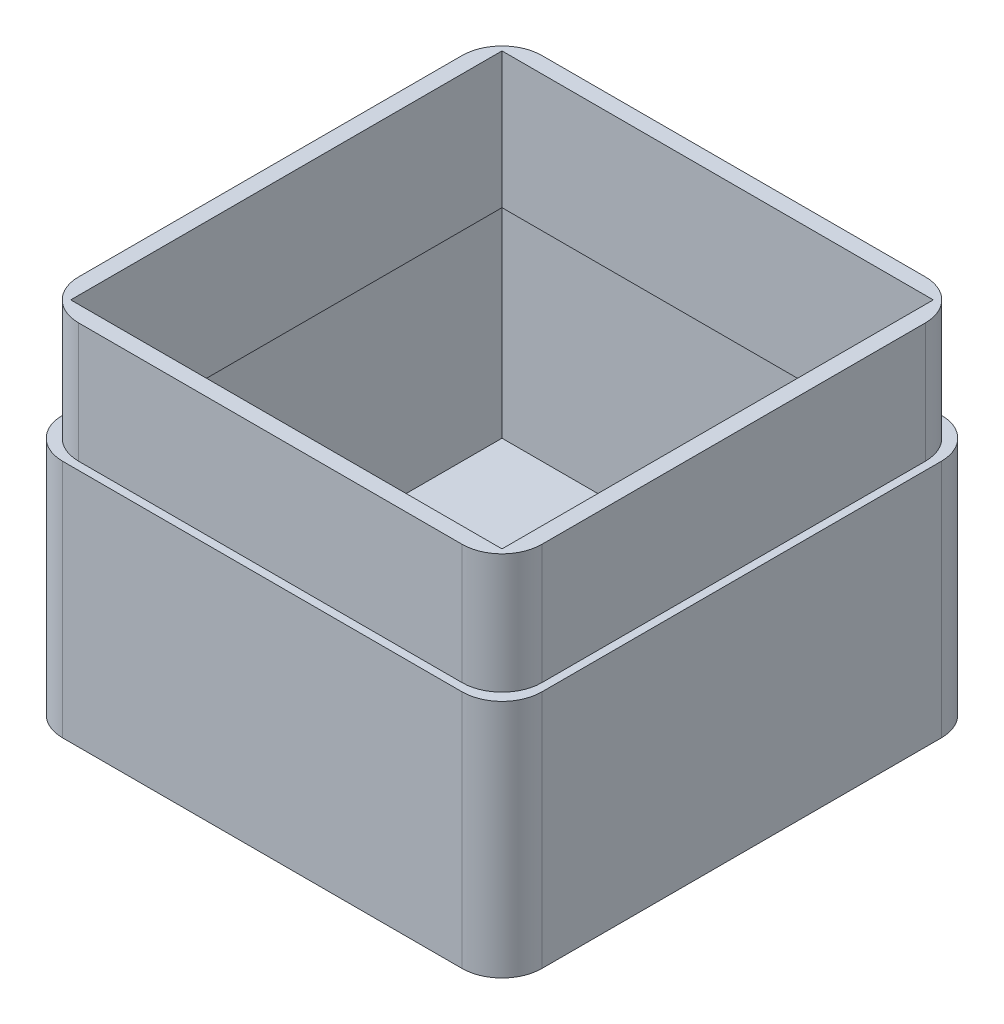
ISO-10303-21;
HEADER;
FILE_DESCRIPTION(('STEP AP214'),'2;1');
FILE_NAME('part.step','',(''),(''),'','','');
FILE_SCHEMA(('AUTOMOTIVE_DESIGN { 1 0 10303 214 1 1 1 1 }'));
ENDSEC;
DATA;
#1=APPLICATION_CONTEXT('core data for automotive mechanical design processes');
#2=APPLICATION_PROTOCOL_DEFINITION('international standard','automotive_design',2000,#1);
#3=PRODUCT_CONTEXT('',#1,'mechanical');
#4=PRODUCT('Part','Part','',(#3));
#5=PRODUCT_RELATED_PRODUCT_CATEGORY('part','',(#4));
#6=PRODUCT_DEFINITION_FORMATION('','',#4);
#7=PRODUCT_DEFINITION_CONTEXT('part definition',#1,'design');
#8=PRODUCT_DEFINITION('design','',#6,#7);
#9=PRODUCT_DEFINITION_SHAPE('','',#8);
#10=(LENGTH_UNIT() NAMED_UNIT(*) SI_UNIT(.MILLI.,.METRE.));
#11=(NAMED_UNIT(*) PLANE_ANGLE_UNIT() SI_UNIT($,.RADIAN.));
#12=(NAMED_UNIT(*) SI_UNIT($,.STERADIAN.) SOLID_ANGLE_UNIT());
#13=UNCERTAINTY_MEASURE_WITH_UNIT(LENGTH_MEASURE(1.E-05),#10,'distance_accuracy_value','');
#14=(GEOMETRIC_REPRESENTATION_CONTEXT(3) GLOBAL_UNCERTAINTY_ASSIGNED_CONTEXT((#13)) GLOBAL_UNIT_ASSIGNED_CONTEXT((#10,
#11,#12)) REPRESENTATION_CONTEXT('',''));
#15=CARTESIAN_POINT('',(0.,0.,0.));
#16=DIRECTION('',(0.,0.,1.));
#17=DIRECTION('',(1.,0.,0.));
#18=AXIS2_PLACEMENT_3D('',#15,#16,#17);
#19=CARTESIAN_POINT('',(-56.9459553231326,90.,-24.7862878858191));
#20=DIRECTION('',(1.,0.,0.));
#21=DIRECTION('',(0.,0.,-1.));
#22=AXIS2_PLACEMENT_3D('',#19,#20,#21);
#23=PLANE('',#22);
#24=DIRECTION('',(0.,0.,1.));
#25=VECTOR('',#24,1.);
#26=CARTESIAN_POINT('',(-56.9459553231326,0.,-24.7862878858191));
#27=LINE('',#26,#25);
#28=CARTESIAN_POINT('',(-56.9459553231326,0.,-14.7862878858191));
#29=VERTEX_POINT('',#28);
#30=CARTESIAN_POINT('',(-56.9459553231326,0.,85.2137121141809));
#31=VERTEX_POINT('',#30);
#32=EDGE_CURVE('E302',#29,#31,#27,.T.);
#33=ORIENTED_EDGE('',*,*,#32,.T.);
#34=DIRECTION('',(0.,-1.,0.));
#35=VECTOR('',#34,1.);
#36=CARTESIAN_POINT('',(-56.9459553231326,90.,85.2137121141809));
#37=LINE('',#36,#35);
#38=CARTESIAN_POINT('',(-56.9459553231326,60.0000000000002,85.2137121141809));
#39=VERTEX_POINT('',#38);
#40=EDGE_CURVE('E352',#31,#39,#37,.F.);
#41=ORIENTED_EDGE('',*,*,#40,.T.);
#42=DIRECTION('',(0.,0.,1.));
#43=VECTOR('',#42,1.);
#44=CARTESIAN_POINT('',(-56.9459553231326,60.0000000000002,-24.7862878858191));
#45=LINE('',#44,#43);
#46=CARTESIAN_POINT('',(-56.9459553231326,60.0000000000002,-14.7862878858191));
#47=VERTEX_POINT('',#46);
#48=EDGE_CURVE('E294',#47,#39,#45,.T.);
#49=ORIENTED_EDGE('',*,*,#48,.F.);
#50=DIRECTION('',(0.,-1.,0.));
#51=VECTOR('',#50,1.);
#52=CARTESIAN_POINT('',(-56.9459553231326,90.,-14.7862878858191));
#53=LINE('',#52,#51);
#54=EDGE_CURVE('E349',#47,#29,#53,.T.);
#55=ORIENTED_EDGE('',*,*,#54,.T.);
#56=EDGE_LOOP('',(#33,#41,#49,#55));
#57=FACE_BOUND('',#56,.T.);
#58=ADVANCED_FACE('F33',(#57),#23,.F.);
#59=CARTESIAN_POINT('',(-56.9459553231326,90.,95.2137121141809));
#60=DIRECTION('',(0.,0.,-1.));
#61=DIRECTION('',(-1.,0.,0.));
#62=AXIS2_PLACEMENT_3D('',#59,#60,#61);
#63=PLANE('',#62);
#64=DIRECTION('',(1.,0.,0.));
#65=VECTOR('',#64,1.);
#66=CARTESIAN_POINT('',(-56.9459553231326,0.,95.2137121141809));
#67=LINE('',#66,#65);
#68=CARTESIAN_POINT('',(-46.9459553231326,0.,95.2137121141809));
#69=VERTEX_POINT('',#68);
#70=CARTESIAN_POINT('',(53.0540446768674,0.,95.2137121141809));
#71=VERTEX_POINT('',#70);
#72=EDGE_CURVE('E305',#69,#71,#67,.T.);
#73=ORIENTED_EDGE('',*,*,#72,.T.);
#74=DIRECTION('',(0.,-1.,0.));
#75=VECTOR('',#74,1.);
#76=CARTESIAN_POINT('',(53.0540446768674,90.,95.2137121141809));
#77=LINE('',#76,#75);
#78=CARTESIAN_POINT('',(53.0540446768674,60.0000000000002,95.2137121141809));
#79=VERTEX_POINT('',#78);
#80=EDGE_CURVE('E347',#71,#79,#77,.F.);
#81=ORIENTED_EDGE('',*,*,#80,.T.);
#82=DIRECTION('',(1.,0.,0.));
#83=VECTOR('',#82,1.);
#84=CARTESIAN_POINT('',(-56.9459553231326,60.0000000000002,95.2137121141809));
#85=LINE('',#84,#83);
#86=CARTESIAN_POINT('',(-46.9459553231326,60.0000000000002,95.2137121141809));
#87=VERTEX_POINT('',#86);
#88=EDGE_CURVE('E297',#87,#79,#85,.T.);
#89=ORIENTED_EDGE('',*,*,#88,.F.);
#90=DIRECTION('',(0.,-1.,0.));
#91=VECTOR('',#90,1.);
#92=CARTESIAN_POINT('',(-46.9459553231326,90.,95.2137121141809));
#93=LINE('',#92,#91);
#94=EDGE_CURVE('E344',#87,#69,#93,.T.);
#95=ORIENTED_EDGE('',*,*,#94,.T.);
#96=EDGE_LOOP('',(#73,#81,#89,#95));
#97=FACE_BOUND('',#96,.T.);
#98=ADVANCED_FACE('F387',(#97),#63,.F.);
#99=CARTESIAN_POINT('',(63.0540446768674,90.,-24.7862878858191));
#100=DIRECTION('',(-1.,0.,0.));
#101=DIRECTION('',(0.,0.,1.));
#102=AXIS2_PLACEMENT_3D('',#99,#100,#101);
#103=PLANE('',#102);
#104=DIRECTION('',(0.,0.,-1.));
#105=VECTOR('',#104,1.);
#106=CARTESIAN_POINT('',(63.0540446768674,60.0000000000002,95.2137121141809));
#107=LINE('',#106,#105);
#108=CARTESIAN_POINT('',(63.0540446768674,60.0000000000002,85.2137121141809));
#109=VERTEX_POINT('',#108);
#110=CARTESIAN_POINT('',(63.0540446768674,60.0000000000002,-14.7862878858191));
#111=VERTEX_POINT('',#110);
#112=EDGE_CURVE('E300',#109,#111,#107,.T.);
#113=ORIENTED_EDGE('',*,*,#112,.F.);
#114=DIRECTION('',(0.,-1.,0.));
#115=VECTOR('',#114,1.);
#116=CARTESIAN_POINT('',(63.0540446768674,90.,85.2137121141809));
#117=LINE('',#116,#115);
#118=CARTESIAN_POINT('',(63.0540446768674,0.,85.2137121141809));
#119=VERTEX_POINT('',#118);
#120=EDGE_CURVE('E333',#109,#119,#117,.T.);
#121=ORIENTED_EDGE('',*,*,#120,.T.);
#122=DIRECTION('',(0.,0.,-1.));
#123=VECTOR('',#122,1.);
#124=CARTESIAN_POINT('',(63.0540446768674,0.,-24.7862878858191));
#125=LINE('',#124,#123);
#126=CARTESIAN_POINT('',(63.0540446768674,0.,-14.7862878858191));
#127=VERTEX_POINT('',#126);
#128=EDGE_CURVE('E308',#119,#127,#125,.T.);
#129=ORIENTED_EDGE('',*,*,#128,.T.);
#130=DIRECTION('',(0.,-1.,0.));
#131=VECTOR('',#130,1.);
#132=CARTESIAN_POINT('',(63.0540446768674,90.,-14.7862878858191));
#133=LINE('',#132,#131);
#134=EDGE_CURVE('E331',#127,#111,#133,.F.);
#135=ORIENTED_EDGE('',*,*,#134,.T.);
#136=EDGE_LOOP('',(#113,#121,#129,#135));
#137=FACE_BOUND('',#136,.T.);
#138=ADVANCED_FACE('F407',(#137),#103,.F.);
#139=CARTESIAN_POINT('',(-56.9459553231326,90.,-24.7862878858191));
#140=DIRECTION('',(0.,0.,1.));
#141=DIRECTION('',(1.,0.,0.));
#142=AXIS2_PLACEMENT_3D('',#139,#140,#141);
#143=PLANE('',#142);
#144=DIRECTION('',(-1.,0.,0.));
#145=VECTOR('',#144,1.);
#146=CARTESIAN_POINT('',(-56.9459553231326,0.,-24.7862878858191));
#147=LINE('',#146,#145);
#148=CARTESIAN_POINT('',(53.0540446768674,0.,-24.7862878858191));
#149=VERTEX_POINT('',#148);
#150=CARTESIAN_POINT('',(-46.9459553231326,0.,-24.7862878858191));
#151=VERTEX_POINT('',#150);
#152=EDGE_CURVE('E311',#149,#151,#147,.T.);
#153=ORIENTED_EDGE('',*,*,#152,.T.);
#154=DIRECTION('',(0.,-1.,0.));
#155=VECTOR('',#154,1.);
#156=CARTESIAN_POINT('',(-46.9459553231326,90.,-24.7862878858191));
#157=LINE('',#156,#155);
#158=CARTESIAN_POINT('',(-46.9459553231326,60.0000000000002,-24.7862878858191));
#159=VERTEX_POINT('',#158);
#160=EDGE_CURVE('E48',#151,#159,#157,.F.);
#161=ORIENTED_EDGE('',*,*,#160,.T.);
#162=DIRECTION('',(-1.,0.,0.));
#163=VECTOR('',#162,1.);
#164=CARTESIAN_POINT('',(63.0540446768674,60.0000000000002,-24.7862878858191));
#165=LINE('',#164,#163);
#166=CARTESIAN_POINT('',(53.0540446768674,60.0000000000002,-24.7862878858191));
#167=VERTEX_POINT('',#166);
#168=EDGE_CURVE('E284',#167,#159,#165,.T.);
#169=ORIENTED_EDGE('',*,*,#168,.F.);
#170=DIRECTION('',(0.,-1.,0.));
#171=VECTOR('',#170,1.);
#172=CARTESIAN_POINT('',(53.0540446768674,90.,-24.7862878858191));
#173=LINE('',#172,#171);
#174=EDGE_CURVE('E364',#167,#149,#173,.T.);
#175=ORIENTED_EDGE('',*,*,#174,.T.);
#176=EDGE_LOOP('',(#153,#161,#169,#175));
#177=FACE_BOUND('',#176,.T.);
#178=ADVANCED_FACE('F401',(#177),#143,.F.);
#179=CARTESIAN_POINT('',(0.,0.,0.));
#180=DIRECTION('',(0.,1.,0.));
#181=DIRECTION('',(0.,0.,1.));
#182=AXIS2_PLACEMENT_3D('',#179,#180,#181);
#183=PLANE('',#182);
#184=ORIENTED_EDGE('',*,*,#128,.F.);
#185=CARTESIAN_POINT('',(53.0540446768674,0.,85.2137121141809));
#186=DIRECTION('',(0.,1.,0.));
#187=DIRECTION('',(0.,0.,1.));
#188=AXIS2_PLACEMENT_3D('',#185,#186,#187);
#189=CIRCLE('',#188,10.);
#190=EDGE_CURVE('E342',#119,#71,#189,.F.);
#191=ORIENTED_EDGE('',*,*,#190,.T.);
#192=ORIENTED_EDGE('',*,*,#72,.F.);
#193=CARTESIAN_POINT('',(-46.9459553231326,0.,85.2137121141809));
#194=DIRECTION('',(0.,1.,0.));
#195=DIRECTION('',(0.,0.,1.));
#196=AXIS2_PLACEMENT_3D('',#193,#194,#195);
#197=CIRCLE('',#196,10.);
#198=EDGE_CURVE('E340',#69,#31,#197,.F.);
#199=ORIENTED_EDGE('',*,*,#198,.T.);
#200=ORIENTED_EDGE('',*,*,#32,.F.);
#201=CARTESIAN_POINT('',(-46.9459553231326,0.,-14.7862878858191));
#202=DIRECTION('',(0.,1.,0.));
#203=DIRECTION('',(0.,0.,1.));
#204=AXIS2_PLACEMENT_3D('',#201,#202,#203);
#205=CIRCLE('',#204,10.);
#206=EDGE_CURVE('E338',#29,#151,#205,.F.);
#207=ORIENTED_EDGE('',*,*,#206,.T.);
#208=ORIENTED_EDGE('',*,*,#152,.F.);
#209=CARTESIAN_POINT('',(53.0540446768674,0.,-14.7862878858191));
#210=DIRECTION('',(0.,1.,0.));
#211=DIRECTION('',(0.,0.,1.));
#212=AXIS2_PLACEMENT_3D('',#209,#210,#211);
#213=CIRCLE('',#212,10.);
#214=EDGE_CURVE('E336',#149,#127,#213,.F.);
#215=ORIENTED_EDGE('',*,*,#214,.T.);
#216=EDGE_LOOP('',(#184,#191,#192,#199,#200,#207,#208,#215));
#217=FACE_BOUND('',#216,.T.);
#218=ADVANCED_FACE('F394',(#217),#183,.F.);
#219=CARTESIAN_POINT('',(0.,60.0000000000002,0.));
#220=DIRECTION('',(0.,1.,0.));
#221=DIRECTION('',(0.,0.,1.));
#222=AXIS2_PLACEMENT_3D('',#219,#220,#221);
#223=PLANE('',#222);
#224=DIRECTION('',(0.,0.,-1.));
#225=VECTOR('',#224,1.);
#226=CARTESIAN_POINT('',(61.0540446768674,60.0000000000002,93.2137121141809));
#227=LINE('',#226,#225);
#228=CARTESIAN_POINT('',(61.0540446768674,60.0000000000002,83.2137121141809));
#229=VERTEX_POINT('',#228);
#230=CARTESIAN_POINT('',(61.0540446768674,60.0000000000002,-12.7862878858191));
#231=VERTEX_POINT('',#230);
#232=EDGE_CURVE('E282',#229,#231,#227,.T.);
#233=ORIENTED_EDGE('',*,*,#232,.F.);
#234=CARTESIAN_POINT('',(51.0540446768674,60.0000000000002,83.2137121141809));
#235=DIRECTION('',(0.,1.,0.));
#236=DIRECTION('',(0.,0.,1.));
#237=AXIS2_PLACEMENT_3D('',#234,#235,#236);
#238=CIRCLE('',#237,10.);
#239=CARTESIAN_POINT('',(51.0540446768674,60.0000000000002,93.2137121141809));
#240=VERTEX_POINT('',#239);
#241=EDGE_CURVE('E368',#229,#240,#238,.F.);
#242=ORIENTED_EDGE('',*,*,#241,.T.);
#243=DIRECTION('',(1.,0.,0.));
#244=VECTOR('',#243,1.);
#245=CARTESIAN_POINT('',(-54.9459553231326,60.0000000000002,93.2137121141809));
#246=LINE('',#245,#244);
#247=CARTESIAN_POINT('',(-44.9459553231326,60.0000000000002,93.2137121141809));
#248=VERTEX_POINT('',#247);
#249=EDGE_CURVE('E279',#248,#240,#246,.T.);
#250=ORIENTED_EDGE('',*,*,#249,.F.);
#251=CARTESIAN_POINT('',(-44.9459553231326,60.0000000000002,83.2137121141809));
#252=DIRECTION('',(0.,1.,0.));
#253=DIRECTION('',(0.,0.,1.));
#254=AXIS2_PLACEMENT_3D('',#251,#252,#253);
#255=CIRCLE('',#254,10.);
#256=CARTESIAN_POINT('',(-54.9459553231326,60.0000000000002,83.2137121141809));
#257=VERTEX_POINT('',#256);
#258=EDGE_CURVE('E370',#248,#257,#255,.F.);
#259=ORIENTED_EDGE('',*,*,#258,.T.);
#260=DIRECTION('',(0.,0.,1.));
#261=VECTOR('',#260,1.);
#262=CARTESIAN_POINT('',(-54.9459553231326,60.0000000000002,-22.7862878858191));
#263=LINE('',#262,#261);
#264=CARTESIAN_POINT('',(-54.9459553231326,60.0000000000002,-12.7862878858191));
#265=VERTEX_POINT('',#264);
#266=EDGE_CURVE('E275',#265,#257,#263,.T.);
#267=ORIENTED_EDGE('',*,*,#266,.F.);
#268=CARTESIAN_POINT('',(-44.9459553231326,60.0000000000002,-12.7862878858191));
#269=DIRECTION('',(0.,1.,0.));
#270=DIRECTION('',(0.,0.,1.));
#271=AXIS2_PLACEMENT_3D('',#268,#269,#270);
#272=CIRCLE('',#271,10.);
#273=CARTESIAN_POINT('',(-44.9459553231326,60.0000000000002,-22.7862878858191));
#274=VERTEX_POINT('',#273);
#275=EDGE_CURVE('E372',#265,#274,#272,.F.);
#276=ORIENTED_EDGE('',*,*,#275,.T.);
#277=DIRECTION('',(-1.,0.,0.));
#278=VECTOR('',#277,1.);
#279=CARTESIAN_POINT('',(61.0540446768674,60.0000000000002,-22.7862878858191));
#280=LINE('',#279,#278);
#281=CARTESIAN_POINT('',(51.0540446768674,60.0000000000002,-22.7862878858191));
#282=VERTEX_POINT('',#281);
#283=EDGE_CURVE('E272',#282,#274,#280,.T.);
#284=ORIENTED_EDGE('',*,*,#283,.F.);
#285=CARTESIAN_POINT('',(51.0540446768674,60.0000000000002,-12.7862878858191));
#286=DIRECTION('',(0.,1.,0.));
#287=DIRECTION('',(0.,0.,1.));
#288=AXIS2_PLACEMENT_3D('',#285,#286,#287);
#289=CIRCLE('',#288,10.);
#290=EDGE_CURVE('E374',#282,#231,#289,.F.);
#291=ORIENTED_EDGE('',*,*,#290,.T.);
#292=EDGE_LOOP('',(#233,#242,#250,#259,#267,#276,#284,#291));
#293=FACE_BOUND('',#292,.T.);
#294=ORIENTED_EDGE('',*,*,#88,.T.);
#295=CARTESIAN_POINT('',(53.0540446768674,60.0000000000002,85.2137121141809));
#296=DIRECTION('',(0.,1.,0.));
#297=DIRECTION('',(0.,0.,1.));
#298=AXIS2_PLACEMENT_3D('',#295,#296,#297);
#299=CIRCLE('',#298,10.);
#300=EDGE_CURVE('E11',#79,#109,#299,.T.);
#301=ORIENTED_EDGE('',*,*,#300,.T.);
#302=ORIENTED_EDGE('',*,*,#112,.T.);
#303=CARTESIAN_POINT('',(53.0540446768674,60.0000000000002,-14.7862878858191));
#304=DIRECTION('',(0.,1.,0.));
#305=DIRECTION('',(0.,0.,1.));
#306=AXIS2_PLACEMENT_3D('',#303,#304,#305);
#307=CIRCLE('',#306,10.);
#308=EDGE_CURVE('E55',#111,#167,#307,.T.);
#309=ORIENTED_EDGE('',*,*,#308,.T.);
#310=ORIENTED_EDGE('',*,*,#168,.T.);
#311=CARTESIAN_POINT('',(-46.9459553231326,60.0000000000002,-14.7862878858191));
#312=DIRECTION('',(0.,1.,0.));
#313=DIRECTION('',(0.,0.,1.));
#314=AXIS2_PLACEMENT_3D('',#311,#312,#313);
#315=CIRCLE('',#314,10.);
#316=EDGE_CURVE('E377',#159,#47,#315,.T.);
#317=ORIENTED_EDGE('',*,*,#316,.T.);
#318=ORIENTED_EDGE('',*,*,#48,.T.);
#319=CARTESIAN_POINT('',(-46.9459553231326,60.0000000000002,85.2137121141809));
#320=DIRECTION('',(0.,1.,0.));
#321=DIRECTION('',(0.,0.,1.));
#322=AXIS2_PLACEMENT_3D('',#319,#320,#321);
#323=CIRCLE('',#322,10.);
#324=EDGE_CURVE('E41',#39,#87,#323,.T.);
#325=ORIENTED_EDGE('',*,*,#324,.T.);
#326=EDGE_LOOP('',(#294,#301,#302,#309,#310,#317,#318,#325));
#327=FACE_BOUND('',#326,.T.);
#328=ADVANCED_FACE('F380',(#293,#327),#223,.T.);
#329=CARTESIAN_POINT('',(61.0540446768674,60.0000000000002,-22.7862878858191));
#330=DIRECTION('',(0.,0.,-1.));
#331=DIRECTION('',(-1.,0.,0.));
#332=AXIS2_PLACEMENT_3D('',#329,#330,#331);
#333=PLANE('',#332);
#334=ORIENTED_EDGE('',*,*,#283,.T.);
#335=DIRECTION('',(0.,1.,0.));
#336=VECTOR('',#335,1.);
#337=CARTESIAN_POINT('',(-44.9459553231326,60.0000000000002,-22.7862878858191));
#338=LINE('',#337,#336);
#339=CARTESIAN_POINT('',(-44.9459553231326,90.,-22.7862878858191));
#340=VERTEX_POINT('',#339);
#341=EDGE_CURVE('E361',#274,#340,#338,.T.);
#342=ORIENTED_EDGE('',*,*,#341,.T.);
#343=DIRECTION('',(-1.,0.,0.));
#344=VECTOR('',#343,1.);
#345=CARTESIAN_POINT('',(61.0540446768674,90.,-22.7862878858191));
#346=LINE('',#345,#344);
#347=CARTESIAN_POINT('',(51.0540446768674,90.,-22.7862878858191));
#348=VERTEX_POINT('',#347);
#349=EDGE_CURVE('E218',#348,#340,#346,.T.);
#350=ORIENTED_EDGE('',*,*,#349,.F.);
#351=DIRECTION('',(0.,1.,0.));
#352=VECTOR('',#351,1.);
#353=CARTESIAN_POINT('',(51.0540446768674,60.0000000000002,-22.7862878858191));
#354=LINE('',#353,#352);
#355=EDGE_CURVE('E359',#348,#282,#354,.F.);
#356=ORIENTED_EDGE('',*,*,#355,.T.);
#357=EDGE_LOOP('',(#334,#342,#350,#356));
#358=FACE_BOUND('',#357,.T.);
#359=ADVANCED_FACE('F443',(#358),#333,.T.);
#360=CARTESIAN_POINT('',(61.0540446768674,60.0000000000002,93.2137121141809));
#361=DIRECTION('',(1.,0.,0.));
#362=DIRECTION('',(0.,0.,-1.));
#363=AXIS2_PLACEMENT_3D('',#360,#361,#362);
#364=PLANE('',#363);
#365=DIRECTION('',(0.,0.,-1.));
#366=VECTOR('',#365,1.);
#367=CARTESIAN_POINT('',(61.0540446768674,90.,93.2137121141809));
#368=LINE('',#367,#366);
#369=CARTESIAN_POINT('',(61.0540446768674,90.,83.2137121141809));
#370=VERTEX_POINT('',#369);
#371=CARTESIAN_POINT('',(61.0540446768674,90.,-12.7862878858191));
#372=VERTEX_POINT('',#371);
#373=EDGE_CURVE('E276',#370,#372,#368,.T.);
#374=ORIENTED_EDGE('',*,*,#373,.F.);
#375=DIRECTION('',(0.,1.,0.));
#376=VECTOR('',#375,1.);
#377=CARTESIAN_POINT('',(61.0540446768674,60.0000000000002,83.2137121141809));
#378=LINE('',#377,#376);
#379=EDGE_CURVE('E329',#370,#229,#378,.F.);
#380=ORIENTED_EDGE('',*,*,#379,.T.);
#381=ORIENTED_EDGE('',*,*,#232,.T.);
#382=DIRECTION('',(0.,1.,0.));
#383=VECTOR('',#382,1.);
#384=CARTESIAN_POINT('',(61.0540446768674,60.0000000000002,-12.7862878858191));
#385=LINE('',#384,#383);
#386=EDGE_CURVE('E326',#231,#372,#385,.T.);
#387=ORIENTED_EDGE('',*,*,#386,.T.);
#388=EDGE_LOOP('',(#374,#380,#381,#387));
#389=FACE_BOUND('',#388,.T.);
#390=ADVANCED_FACE('F447',(#389),#364,.T.);
#391=CARTESIAN_POINT('',(-54.9459553231326,60.0000000000002,93.2137121141809));
#392=DIRECTION('',(0.,0.,1.));
#393=DIRECTION('',(1.,0.,0.));
#394=AXIS2_PLACEMENT_3D('',#391,#392,#393);
#395=PLANE('',#394);
#396=ORIENTED_EDGE('',*,*,#249,.T.);
#397=DIRECTION('',(0.,1.,0.));
#398=VECTOR('',#397,1.);
#399=CARTESIAN_POINT('',(51.0540446768674,60.0000000000002,93.2137121141809));
#400=LINE('',#399,#398);
#401=CARTESIAN_POINT('',(51.0540446768674,90.,93.2137121141809));
#402=VERTEX_POINT('',#401);
#403=EDGE_CURVE('E315',#240,#402,#400,.T.);
#404=ORIENTED_EDGE('',*,*,#403,.T.);
#405=DIRECTION('',(1.,0.,0.));
#406=VECTOR('',#405,1.);
#407=CARTESIAN_POINT('',(-54.9459553231326,90.,93.2137121141809));
#408=LINE('',#407,#406);
#409=CARTESIAN_POINT('',(-44.9459553231326,90.,93.2137121141809));
#410=VERTEX_POINT('',#409);
#411=EDGE_CURVE('E288',#410,#402,#408,.T.);
#412=ORIENTED_EDGE('',*,*,#411,.F.);
#413=DIRECTION('',(0.,1.,0.));
#414=VECTOR('',#413,1.);
#415=CARTESIAN_POINT('',(-44.9459553231326,60.0000000000002,93.2137121141809));
#416=LINE('',#415,#414);
#417=EDGE_CURVE('E313',#410,#248,#416,.F.);
#418=ORIENTED_EDGE('',*,*,#417,.T.);
#419=EDGE_LOOP('',(#396,#404,#412,#418));
#420=FACE_BOUND('',#419,.T.);
#421=ADVANCED_FACE('F451',(#420),#395,.T.);
#422=CARTESIAN_POINT('',(-54.9459553231326,60.0000000000002,-22.7862878858191));
#423=DIRECTION('',(-1.,0.,0.));
#424=DIRECTION('',(0.,0.,1.));
#425=AXIS2_PLACEMENT_3D('',#422,#423,#424);
#426=PLANE('',#425);
#427=ORIENTED_EDGE('',*,*,#266,.T.);
#428=DIRECTION('',(0.,1.,0.));
#429=VECTOR('',#428,1.);
#430=CARTESIAN_POINT('',(-54.9459553231326,60.0000000000002,83.2137121141809));
#431=LINE('',#430,#429);
#432=CARTESIAN_POINT('',(-54.9459553231326,90.,83.2137121141809));
#433=VERTEX_POINT('',#432);
#434=EDGE_CURVE('E356',#257,#433,#431,.T.);
#435=ORIENTED_EDGE('',*,*,#434,.T.);
#436=DIRECTION('',(0.,0.,1.));
#437=VECTOR('',#436,1.);
#438=CARTESIAN_POINT('',(-54.9459553231326,90.,-22.7862878858191));
#439=LINE('',#438,#437);
#440=CARTESIAN_POINT('',(-54.9459553231326,90.,-12.7862878858191));
#441=VERTEX_POINT('',#440);
#442=EDGE_CURVE('E222',#441,#433,#439,.T.);
#443=ORIENTED_EDGE('',*,*,#442,.F.);
#444=DIRECTION('',(0.,1.,0.));
#445=VECTOR('',#444,1.);
#446=CARTESIAN_POINT('',(-54.9459553231326,60.0000000000002,-12.7862878858191));
#447=LINE('',#446,#445);
#448=EDGE_CURVE('E354',#441,#265,#447,.F.);
#449=ORIENTED_EDGE('',*,*,#448,.T.);
#450=EDGE_LOOP('',(#427,#435,#443,#449));
#451=FACE_BOUND('',#450,.T.);
#452=ADVANCED_FACE('F439',(#451),#426,.T.);
#453=CARTESIAN_POINT('',(0.,90.,0.));
#454=DIRECTION('',(0.,1.,0.));
#455=DIRECTION('',(0.,0.,1.));
#456=AXIS2_PLACEMENT_3D('',#453,#454,#455);
#457=PLANE('',#456);
#458=DIRECTION('',(0.,0.,-1.));
#459=VECTOR('',#458,1.);
#460=CARTESIAN_POINT('',(57.0540446768674,90.,0.));
#461=LINE('',#460,#459);
#462=CARTESIAN_POINT('',(57.0540446768674,90.,89.2137121141809));
#463=VERTEX_POINT('',#462);
#464=CARTESIAN_POINT('',(57.0540446768674,90.,-18.7862878858191));
#465=VERTEX_POINT('',#464);
#466=EDGE_CURVE('E254',#463,#465,#461,.T.);
#467=ORIENTED_EDGE('',*,*,#466,.F.);
#468=DIRECTION('',(1.,0.,0.));
#469=VECTOR('',#468,1.);
#470=CARTESIAN_POINT('',(0.,90.,89.2137121141809));
#471=LINE('',#470,#469);
#472=CARTESIAN_POINT('',(-50.9459553231326,90.,89.2137121141809));
#473=VERTEX_POINT('',#472);
#474=EDGE_CURVE('E267',#473,#463,#471,.T.);
#475=ORIENTED_EDGE('',*,*,#474,.F.);
#476=DIRECTION('',(0.,0.,1.));
#477=VECTOR('',#476,1.);
#478=CARTESIAN_POINT('',(-50.9459553231326,90.,0.));
#479=LINE('',#478,#477);
#480=CARTESIAN_POINT('',(-50.9459553231326,90.,-18.7862878858191));
#481=VERTEX_POINT('',#480);
#482=EDGE_CURVE('E265',#481,#473,#479,.T.);
#483=ORIENTED_EDGE('',*,*,#482,.F.);
#484=DIRECTION('',(-1.,0.,0.));
#485=VECTOR('',#484,1.);
#486=CARTESIAN_POINT('',(0.,90.,-18.7862878858191));
#487=LINE('',#486,#485);
#488=EDGE_CURVE('E262',#465,#481,#487,.T.);
#489=ORIENTED_EDGE('',*,*,#488,.F.);
#490=EDGE_LOOP('',(#467,#475,#483,#489));
#491=FACE_BOUND('',#490,.T.);
#492=ORIENTED_EDGE('',*,*,#411,.T.);
#493=CARTESIAN_POINT('',(51.0540446768674,90.,83.2137121141809));
#494=DIRECTION('',(0.,1.,0.));
#495=DIRECTION('',(0.,0.,1.));
#496=AXIS2_PLACEMENT_3D('',#493,#494,#495);
#497=CIRCLE('',#496,10.);
#498=EDGE_CURVE('E324',#402,#370,#497,.T.);
#499=ORIENTED_EDGE('',*,*,#498,.T.);
#500=ORIENTED_EDGE('',*,*,#373,.T.);
#501=CARTESIAN_POINT('',(51.0540446768674,90.,-12.7862878858191));
#502=DIRECTION('',(0.,1.,0.));
#503=DIRECTION('',(0.,0.,1.));
#504=AXIS2_PLACEMENT_3D('',#501,#502,#503);
#505=CIRCLE('',#504,10.);
#506=EDGE_CURVE('E318',#372,#348,#505,.T.);
#507=ORIENTED_EDGE('',*,*,#506,.T.);
#508=ORIENTED_EDGE('',*,*,#349,.T.);
#509=CARTESIAN_POINT('',(-44.9459553231326,90.,-12.7862878858191));
#510=DIRECTION('',(0.,1.,0.));
#511=DIRECTION('',(0.,0.,1.));
#512=AXIS2_PLACEMENT_3D('',#509,#510,#511);
#513=CIRCLE('',#512,10.);
#514=EDGE_CURVE('E320',#340,#441,#513,.T.);
#515=ORIENTED_EDGE('',*,*,#514,.T.);
#516=ORIENTED_EDGE('',*,*,#442,.T.);
#517=CARTESIAN_POINT('',(-44.9459553231326,90.,83.2137121141809));
#518=DIRECTION('',(0.,1.,0.));
#519=DIRECTION('',(0.,0.,1.));
#520=AXIS2_PLACEMENT_3D('',#517,#518,#519);
#521=CIRCLE('',#520,10.);
#522=EDGE_CURVE('E322',#433,#410,#521,.T.);
#523=ORIENTED_EDGE('',*,*,#522,.T.);
#524=EDGE_LOOP('',(#492,#499,#500,#507,#508,#515,#516,#523));
#525=FACE_BOUND('',#524,.T.);
#526=ADVANCED_FACE('F436',(#491,#525),#457,.T.);
#527=CARTESIAN_POINT('',(-52.9459553231326,90.,-24.7862878858191));
#528=DIRECTION('',(1.,0.,0.));
#529=DIRECTION('',(0.,0.,-1.));
#530=AXIS2_PLACEMENT_3D('',#527,#528,#529);
#531=PLANE('',#530);
#532=DIRECTION('',(0.,0.,1.));
#533=VECTOR('',#532,1.);
#534=CARTESIAN_POINT('',(-52.9459553231326,56.0000000000002,-24.7862878858191));
#535=LINE('',#534,#533);
#536=CARTESIAN_POINT('',(-52.9459553231326,56.0000000000002,-20.7862878858191));
#537=VERTEX_POINT('',#536);
#538=CARTESIAN_POINT('',(-52.9459553231326,56.0000000000002,91.2137121141809));
#539=VERTEX_POINT('',#538);
#540=EDGE_CURVE('E195',#537,#539,#535,.T.);
#541=ORIENTED_EDGE('',*,*,#540,.T.);
#542=DIRECTION('',(0.,-1.,0.));
#543=VECTOR('',#542,1.);
#544=CARTESIAN_POINT('',(-52.9459553231326,90.,91.2137121141809));
#545=LINE('',#544,#543);
#546=CARTESIAN_POINT('',(-52.9459553231326,4.,91.2137121141809));
#547=VERTEX_POINT('',#546);
#548=EDGE_CURVE('E200',#539,#547,#545,.T.);
#549=ORIENTED_EDGE('',*,*,#548,.T.);
#550=DIRECTION('',(0.,0.,1.));
#551=VECTOR('',#550,1.);
#552=CARTESIAN_POINT('',(-52.9459553231326,4.,-24.7862878858191));
#553=LINE('',#552,#551);
#554=CARTESIAN_POINT('',(-52.9459553231326,4.,-20.7862878858191));
#555=VERTEX_POINT('',#554);
#556=EDGE_CURVE('E227',#555,#547,#553,.T.);
#557=ORIENTED_EDGE('',*,*,#556,.F.);
#558=DIRECTION('',(0.,-1.,0.));
#559=VECTOR('',#558,1.);
#560=CARTESIAN_POINT('',(-52.9459553231326,90.,-20.7862878858191));
#561=LINE('',#560,#559);
#562=EDGE_CURVE('E202',#537,#555,#561,.T.);
#563=ORIENTED_EDGE('',*,*,#562,.F.);
#564=EDGE_LOOP('',(#541,#549,#557,#563));
#565=FACE_BOUND('',#564,.T.);
#566=ADVANCED_FACE('F197',(#565),#531,.T.);
#567=CARTESIAN_POINT('',(-56.9459553231326,90.,91.2137121141809));
#568=DIRECTION('',(0.,0.,-1.));
#569=DIRECTION('',(-1.,0.,0.));
#570=AXIS2_PLACEMENT_3D('',#567,#568,#569);
#571=PLANE('',#570);
#572=DIRECTION('',(1.,0.,0.));
#573=VECTOR('',#572,1.);
#574=CARTESIAN_POINT('',(-56.9459553231326,56.0000000000002,91.2137121141809));
#575=LINE('',#574,#573);
#576=CARTESIAN_POINT('',(59.0540446768674,56.0000000000002,91.2137121141809));
#577=VERTEX_POINT('',#576);
#578=EDGE_CURVE('E205',#539,#577,#575,.T.);
#579=ORIENTED_EDGE('',*,*,#578,.T.);
#580=DIRECTION('',(0.,-1.,0.));
#581=VECTOR('',#580,1.);
#582=CARTESIAN_POINT('',(59.0540446768674,90.,91.2137121141809));
#583=LINE('',#582,#581);
#584=CARTESIAN_POINT('',(59.0540446768674,4.,91.2137121141809));
#585=VERTEX_POINT('',#584);
#586=EDGE_CURVE('E219',#577,#585,#583,.T.);
#587=ORIENTED_EDGE('',*,*,#586,.T.);
#588=DIRECTION('',(1.,0.,0.));
#589=VECTOR('',#588,1.);
#590=CARTESIAN_POINT('',(-56.9459553231326,4.,91.2137121141809));
#591=LINE('',#590,#589);
#592=EDGE_CURVE('E216',#547,#585,#591,.T.);
#593=ORIENTED_EDGE('',*,*,#592,.F.);
#594=ORIENTED_EDGE('',*,*,#548,.F.);
#595=EDGE_LOOP('',(#579,#587,#593,#594));
#596=FACE_BOUND('',#595,.T.);
#597=ADVANCED_FACE('F214',(#596),#571,.T.);
#598=CARTESIAN_POINT('',(59.0540446768674,90.,-24.7862878858191));
#599=DIRECTION('',(-1.,0.,0.));
#600=DIRECTION('',(0.,0.,1.));
#601=AXIS2_PLACEMENT_3D('',#598,#599,#600);
#602=PLANE('',#601);
#603=DIRECTION('',(0.,0.,-1.));
#604=VECTOR('',#603,1.);
#605=CARTESIAN_POINT('',(59.0540446768674,56.0000000000002,-24.7862878858191));
#606=LINE('',#605,#604);
#607=CARTESIAN_POINT('',(59.0540446768674,56.0000000000002,-20.7862878858191));
#608=VERTEX_POINT('',#607);
#609=EDGE_CURVE('E210',#577,#608,#606,.T.);
#610=ORIENTED_EDGE('',*,*,#609,.T.);
#611=DIRECTION('',(0.,-1.,0.));
#612=VECTOR('',#611,1.);
#613=CARTESIAN_POINT('',(59.0540446768674,90.,-20.7862878858191));
#614=LINE('',#613,#612);
#615=CARTESIAN_POINT('',(59.0540446768674,4.,-20.7862878858191));
#616=VERTEX_POINT('',#615);
#617=EDGE_CURVE('E224',#608,#616,#614,.T.);
#618=ORIENTED_EDGE('',*,*,#617,.T.);
#619=DIRECTION('',(0.,0.,-1.));
#620=VECTOR('',#619,1.);
#621=CARTESIAN_POINT('',(59.0540446768674,4.,-24.7862878858191));
#622=LINE('',#621,#620);
#623=EDGE_CURVE('E230',#585,#616,#622,.T.);
#624=ORIENTED_EDGE('',*,*,#623,.F.);
#625=ORIENTED_EDGE('',*,*,#586,.F.);
#626=EDGE_LOOP('',(#610,#618,#624,#625));
#627=FACE_BOUND('',#626,.T.);
#628=ADVANCED_FACE('F484',(#627),#602,.T.);
#629=CARTESIAN_POINT('',(-56.9459553231326,90.,-20.7862878858191));
#630=DIRECTION('',(0.,0.,1.));
#631=DIRECTION('',(1.,0.,0.));
#632=AXIS2_PLACEMENT_3D('',#629,#630,#631);
#633=PLANE('',#632);
#634=DIRECTION('',(-1.,0.,0.));
#635=VECTOR('',#634,1.);
#636=CARTESIAN_POINT('',(-56.9459553231326,56.0000000000002,-20.7862878858191));
#637=LINE('',#636,#635);
#638=EDGE_CURVE('E206',#608,#537,#637,.T.);
#639=ORIENTED_EDGE('',*,*,#638,.T.);
#640=ORIENTED_EDGE('',*,*,#562,.T.);
#641=DIRECTION('',(-1.,0.,0.));
#642=VECTOR('',#641,1.);
#643=CARTESIAN_POINT('',(-56.9459553231326,4.,-20.7862878858191));
#644=LINE('',#643,#642);
#645=EDGE_CURVE('E235',#616,#555,#644,.T.);
#646=ORIENTED_EDGE('',*,*,#645,.F.);
#647=ORIENTED_EDGE('',*,*,#617,.F.);
#648=EDGE_LOOP('',(#639,#640,#646,#647));
#649=FACE_BOUND('',#648,.T.);
#650=ADVANCED_FACE('F480',(#649),#633,.T.);
#651=CARTESIAN_POINT('',(0.,4.,0.));
#652=DIRECTION('',(0.,1.,0.));
#653=DIRECTION('',(0.,0.,1.));
#654=AXIS2_PLACEMENT_3D('',#651,#652,#653);
#655=PLANE('',#654);
#656=ORIENTED_EDGE('',*,*,#556,.T.);
#657=ORIENTED_EDGE('',*,*,#592,.T.);
#658=ORIENTED_EDGE('',*,*,#623,.T.);
#659=ORIENTED_EDGE('',*,*,#645,.T.);
#660=EDGE_LOOP('',(#656,#657,#658,#659));
#661=FACE_BOUND('',#660,.T.);
#662=ADVANCED_FACE('F476',(#661),#655,.T.);
#663=CARTESIAN_POINT('',(0.,56.0000000000002,0.));
#664=DIRECTION('',(0.,1.,0.));
#665=DIRECTION('',(0.,0.,1.));
#666=AXIS2_PLACEMENT_3D('',#663,#664,#665);
#667=PLANE('',#666);
#668=DIRECTION('',(0.,0.,-1.));
#669=VECTOR('',#668,1.);
#670=CARTESIAN_POINT('',(57.0540446768674,56.0000000000002,0.));
#671=LINE('',#670,#669);
#672=CARTESIAN_POINT('',(57.0540446768674,56.0000000000002,89.2137121141809));
#673=VERTEX_POINT('',#672);
#674=CARTESIAN_POINT('',(57.0540446768674,56.0000000000002,-18.7862878858191));
#675=VERTEX_POINT('',#674);
#676=EDGE_CURVE('E241',#673,#675,#671,.T.);
#677=ORIENTED_EDGE('',*,*,#676,.T.);
#678=DIRECTION('',(-1.,0.,0.));
#679=VECTOR('',#678,1.);
#680=CARTESIAN_POINT('',(0.,56.0000000000002,-18.7862878858191));
#681=LINE('',#680,#679);
#682=CARTESIAN_POINT('',(-50.9459553231326,56.0000000000002,-18.7862878858191));
#683=VERTEX_POINT('',#682);
#684=EDGE_CURVE('E251',#675,#683,#681,.T.);
#685=ORIENTED_EDGE('',*,*,#684,.T.);
#686=DIRECTION('',(0.,0.,1.));
#687=VECTOR('',#686,1.);
#688=CARTESIAN_POINT('',(-50.9459553231326,56.0000000000002,0.));
#689=LINE('',#688,#687);
#690=CARTESIAN_POINT('',(-50.9459553231326,56.0000000000002,89.2137121141809));
#691=VERTEX_POINT('',#690);
#692=EDGE_CURVE('E248',#683,#691,#689,.T.);
#693=ORIENTED_EDGE('',*,*,#692,.T.);
#694=DIRECTION('',(1.,0.,0.));
#695=VECTOR('',#694,1.);
#696=CARTESIAN_POINT('',(0.,56.0000000000002,89.2137121141809));
#697=LINE('',#696,#695);
#698=EDGE_CURVE('E245',#691,#673,#697,.T.);
#699=ORIENTED_EDGE('',*,*,#698,.T.);
#700=EDGE_LOOP('',(#677,#685,#693,#699));
#701=FACE_BOUND('',#700,.T.);
#702=ORIENTED_EDGE('',*,*,#638,.F.);
#703=ORIENTED_EDGE('',*,*,#609,.F.);
#704=ORIENTED_EDGE('',*,*,#578,.F.);
#705=ORIENTED_EDGE('',*,*,#540,.F.);
#706=EDGE_LOOP('',(#702,#703,#704,#705));
#707=FACE_BOUND('',#706,.T.);
#708=ADVANCED_FACE('F209',(#701,#707),#667,.F.);
#709=CARTESIAN_POINT('',(61.0540446768674,60.0000000000002,-18.7862878858191));
#710=DIRECTION('',(0.,0.,-1.));
#711=DIRECTION('',(-1.,0.,0.));
#712=AXIS2_PLACEMENT_3D('',#709,#710,#711);
#713=PLANE('',#712);
#714=ORIENTED_EDGE('',*,*,#488,.T.);
#715=DIRECTION('',(0.,1.,0.));
#716=VECTOR('',#715,1.);
#717=CARTESIAN_POINT('',(-50.9459553231326,60.0000000000002,-18.7862878858191));
#718=LINE('',#717,#716);
#719=EDGE_CURVE('E244',#683,#481,#718,.T.);
#720=ORIENTED_EDGE('',*,*,#719,.F.);
#721=ORIENTED_EDGE('',*,*,#684,.F.);
#722=DIRECTION('',(0.,1.,0.));
#723=VECTOR('',#722,1.);
#724=CARTESIAN_POINT('',(57.0540446768674,60.0000000000002,-18.7862878858191));
#725=LINE('',#724,#723);
#726=EDGE_CURVE('E238',#675,#465,#725,.T.);
#727=ORIENTED_EDGE('',*,*,#726,.T.);
#728=EDGE_LOOP('',(#714,#720,#721,#727));
#729=FACE_BOUND('',#728,.T.);
#730=ADVANCED_FACE('F469',(#729),#713,.F.);
#731=CARTESIAN_POINT('',(57.0540446768674,60.0000000000002,93.2137121141809));
#732=DIRECTION('',(1.,0.,0.));
#733=DIRECTION('',(0.,0.,-1.));
#734=AXIS2_PLACEMENT_3D('',#731,#732,#733);
#735=PLANE('',#734);
#736=ORIENTED_EDGE('',*,*,#466,.T.);
#737=ORIENTED_EDGE('',*,*,#726,.F.);
#738=ORIENTED_EDGE('',*,*,#676,.F.);
#739=DIRECTION('',(0.,1.,0.));
#740=VECTOR('',#739,1.);
#741=CARTESIAN_POINT('',(57.0540446768674,60.0000000000002,89.2137121141809));
#742=LINE('',#741,#740);
#743=EDGE_CURVE('E256',#673,#463,#742,.T.);
#744=ORIENTED_EDGE('',*,*,#743,.T.);
#745=EDGE_LOOP('',(#736,#737,#738,#744));
#746=FACE_BOUND('',#745,.T.);
#747=ADVANCED_FACE('F465',(#746),#735,.F.);
#748=CARTESIAN_POINT('',(-54.9459553231326,60.0000000000002,89.2137121141809));
#749=DIRECTION('',(0.,0.,1.));
#750=DIRECTION('',(1.,0.,0.));
#751=AXIS2_PLACEMENT_3D('',#748,#749,#750);
#752=PLANE('',#751);
#753=ORIENTED_EDGE('',*,*,#474,.T.);
#754=ORIENTED_EDGE('',*,*,#743,.F.);
#755=ORIENTED_EDGE('',*,*,#698,.F.);
#756=DIRECTION('',(0.,1.,0.));
#757=VECTOR('',#756,1.);
#758=CARTESIAN_POINT('',(-50.9459553231326,60.0000000000002,89.2137121141809));
#759=LINE('',#758,#757);
#760=EDGE_CURVE('E258',#691,#473,#759,.T.);
#761=ORIENTED_EDGE('',*,*,#760,.T.);
#762=EDGE_LOOP('',(#753,#754,#755,#761));
#763=FACE_BOUND('',#762,.T.);
#764=ADVANCED_FACE('F461',(#763),#752,.F.);
#765=CARTESIAN_POINT('',(-50.9459553231326,60.0000000000002,-22.7862878858191));
#766=DIRECTION('',(-1.,0.,0.));
#767=DIRECTION('',(0.,0.,1.));
#768=AXIS2_PLACEMENT_3D('',#765,#766,#767);
#769=PLANE('',#768);
#770=ORIENTED_EDGE('',*,*,#482,.T.);
#771=ORIENTED_EDGE('',*,*,#760,.F.);
#772=ORIENTED_EDGE('',*,*,#692,.F.);
#773=ORIENTED_EDGE('',*,*,#719,.T.);
#774=EDGE_LOOP('',(#770,#771,#772,#773));
#775=FACE_BOUND('',#774,.T.);
#776=ADVANCED_FACE('F420',(#775),#769,.F.);
#777=CARTESIAN_POINT('',(51.0540446768674,60.0000000000002,83.2137121141809));
#778=DIRECTION('',(0.,1.,0.));
#779=DIRECTION('',(0.,0.,1.));
#780=AXIS2_PLACEMENT_3D('',#777,#778,#779);
#781=CYLINDRICAL_SURFACE('',#780,10.);
#782=ORIENTED_EDGE('',*,*,#241,.F.);
#783=ORIENTED_EDGE('',*,*,#379,.F.);
#784=ORIENTED_EDGE('',*,*,#498,.F.);
#785=ORIENTED_EDGE('',*,*,#403,.F.);
#786=EDGE_LOOP('',(#782,#783,#784,#785));
#787=FACE_BOUND('',#786,.T.);
#788=ADVANCED_FACE('F412',(#787),#781,.T.);
#789=CARTESIAN_POINT('',(53.0540446768674,90.,85.2137121141809));
#790=DIRECTION('',(0.,-1.,0.));
#791=DIRECTION('',(0.,0.,-1.));
#792=AXIS2_PLACEMENT_3D('',#789,#790,#791);
#793=CYLINDRICAL_SURFACE('',#792,10.);
#794=ORIENTED_EDGE('',*,*,#300,.F.);
#795=ORIENTED_EDGE('',*,*,#80,.F.);
#796=ORIENTED_EDGE('',*,*,#190,.F.);
#797=ORIENTED_EDGE('',*,*,#120,.F.);
#798=EDGE_LOOP('',(#794,#795,#796,#797));
#799=FACE_BOUND('',#798,.T.);
#800=ADVANCED_FACE('F410',(#799),#793,.T.);
#801=CARTESIAN_POINT('',(-46.9459553231326,90.,85.2137121141809));
#802=DIRECTION('',(0.,-1.,0.));
#803=DIRECTION('',(0.,0.,-1.));
#804=AXIS2_PLACEMENT_3D('',#801,#802,#803);
#805=CYLINDRICAL_SURFACE('',#804,10.);
#806=ORIENTED_EDGE('',*,*,#324,.F.);
#807=ORIENTED_EDGE('',*,*,#40,.F.);
#808=ORIENTED_EDGE('',*,*,#198,.F.);
#809=ORIENTED_EDGE('',*,*,#94,.F.);
#810=EDGE_LOOP('',(#806,#807,#808,#809));
#811=FACE_BOUND('',#810,.T.);
#812=ADVANCED_FACE('F390',(#811),#805,.T.);
#813=CARTESIAN_POINT('',(-44.9459553231326,60.0000000000002,83.2137121141809));
#814=DIRECTION('',(0.,1.,0.));
#815=DIRECTION('',(0.,0.,1.));
#816=AXIS2_PLACEMENT_3D('',#813,#814,#815);
#817=CYLINDRICAL_SURFACE('',#816,10.);
#818=ORIENTED_EDGE('',*,*,#258,.F.);
#819=ORIENTED_EDGE('',*,*,#417,.F.);
#820=ORIENTED_EDGE('',*,*,#522,.F.);
#821=ORIENTED_EDGE('',*,*,#434,.F.);
#822=EDGE_LOOP('',(#818,#819,#820,#821));
#823=FACE_BOUND('',#822,.T.);
#824=ADVANCED_FACE('F418',(#823),#817,.T.);
#825=CARTESIAN_POINT('',(-44.9459553231326,60.0000000000002,-12.7862878858191));
#826=DIRECTION('',(0.,1.,0.));
#827=DIRECTION('',(0.,0.,1.));
#828=AXIS2_PLACEMENT_3D('',#825,#826,#827);
#829=CYLINDRICAL_SURFACE('',#828,10.);
#830=ORIENTED_EDGE('',*,*,#275,.F.);
#831=ORIENTED_EDGE('',*,*,#448,.F.);
#832=ORIENTED_EDGE('',*,*,#514,.F.);
#833=ORIENTED_EDGE('',*,*,#341,.F.);
#834=EDGE_LOOP('',(#830,#831,#832,#833));
#835=FACE_BOUND('',#834,.T.);
#836=ADVANCED_FACE('F558',(#835),#829,.T.);
#837=CARTESIAN_POINT('',(-46.9459553231326,90.,-14.7862878858191));
#838=DIRECTION('',(0.,-1.,0.));
#839=DIRECTION('',(0.,0.,-1.));
#840=AXIS2_PLACEMENT_3D('',#837,#838,#839);
#841=CYLINDRICAL_SURFACE('',#840,10.);
#842=ORIENTED_EDGE('',*,*,#316,.F.);
#843=ORIENTED_EDGE('',*,*,#160,.F.);
#844=ORIENTED_EDGE('',*,*,#206,.F.);
#845=ORIENTED_EDGE('',*,*,#54,.F.);
#846=EDGE_LOOP('',(#842,#843,#844,#845));
#847=FACE_BOUND('',#846,.T.);
#848=ADVANCED_FACE('F399',(#847),#841,.T.);
#849=CARTESIAN_POINT('',(51.0540446768674,60.0000000000002,-12.7862878858191));
#850=DIRECTION('',(0.,1.,0.));
#851=DIRECTION('',(0.,0.,1.));
#852=AXIS2_PLACEMENT_3D('',#849,#850,#851);
#853=CYLINDRICAL_SURFACE('',#852,10.);
#854=ORIENTED_EDGE('',*,*,#290,.F.);
#855=ORIENTED_EDGE('',*,*,#355,.F.);
#856=ORIENTED_EDGE('',*,*,#506,.F.);
#857=ORIENTED_EDGE('',*,*,#386,.F.);
#858=EDGE_LOOP('',(#854,#855,#856,#857));
#859=FACE_BOUND('',#858,.T.);
#860=ADVANCED_FACE('F577',(#859),#853,.T.);
#861=CARTESIAN_POINT('',(53.0540446768674,90.,-14.7862878858191));
#862=DIRECTION('',(0.,-1.,0.));
#863=DIRECTION('',(0.,0.,-1.));
#864=AXIS2_PLACEMENT_3D('',#861,#862,#863);
#865=CYLINDRICAL_SURFACE('',#864,10.);
#866=ORIENTED_EDGE('',*,*,#308,.F.);
#867=ORIENTED_EDGE('',*,*,#134,.F.);
#868=ORIENTED_EDGE('',*,*,#214,.F.);
#869=ORIENTED_EDGE('',*,*,#174,.F.);
#870=EDGE_LOOP('',(#866,#867,#868,#869));
#871=FACE_BOUND('',#870,.T.);
#872=ADVANCED_FACE('F35',(#871),#865,.T.);
#873=CLOSED_SHELL('',(#58,#98,#138,#178,#218,#328,#359,#390,#421,#452,#526,#566,#597,#628,#650,
#662,#708,#730,#747,#764,#776,#788,#800,#812,#824,#836,#848,#860,#872));
#874=MANIFOLD_SOLID_BREP('B2',#873);
#875=ADVANCED_BREP_SHAPE_REPRESENTATION('',(#18,#874),#14);
#876=SHAPE_DEFINITION_REPRESENTATION(#9,#875);
ENDSEC;
END-ISO-10303-21;
